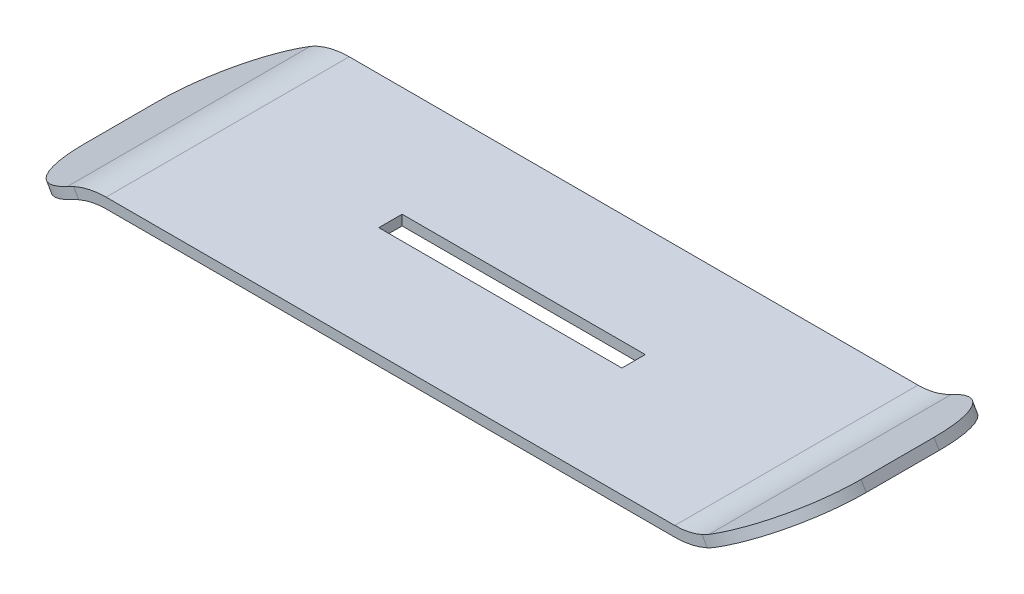
ISO-10303-21;
HEADER;
FILE_DESCRIPTION(('STEP AP214'),'2;1');
FILE_NAME('part.step','',(''),(''),'','','');
FILE_SCHEMA(('AUTOMOTIVE_DESIGN { 1 0 10303 214 1 1 1 1 }'));
ENDSEC;
DATA;
#1=APPLICATION_CONTEXT('core data for automotive mechanical design processes');
#2=APPLICATION_PROTOCOL_DEFINITION('international standard','automotive_design',2000,#1);
#3=PRODUCT_CONTEXT('',#1,'mechanical');
#4=PRODUCT('Part','Part','',(#3));
#5=PRODUCT_RELATED_PRODUCT_CATEGORY('part','',(#4));
#6=PRODUCT_DEFINITION_FORMATION('','',#4);
#7=PRODUCT_DEFINITION_CONTEXT('part definition',#1,'design');
#8=PRODUCT_DEFINITION('design','',#6,#7);
#9=PRODUCT_DEFINITION_SHAPE('','',#8);
#10=(LENGTH_UNIT() NAMED_UNIT(*) SI_UNIT(.MILLI.,.METRE.));
#11=(NAMED_UNIT(*) PLANE_ANGLE_UNIT() SI_UNIT($,.RADIAN.));
#12=(NAMED_UNIT(*) SI_UNIT($,.STERADIAN.) SOLID_ANGLE_UNIT());
#13=UNCERTAINTY_MEASURE_WITH_UNIT(LENGTH_MEASURE(1.E-05),#10,'distance_accuracy_value','');
#14=(GEOMETRIC_REPRESENTATION_CONTEXT(3) GLOBAL_UNCERTAINTY_ASSIGNED_CONTEXT((#13)) GLOBAL_UNIT_ASSIGNED_CONTEXT((#10,
#11,#12)) REPRESENTATION_CONTEXT('',''));
#15=CARTESIAN_POINT('',(0.,0.,0.));
#16=DIRECTION('',(0.,0.,1.));
#17=DIRECTION('',(1.,0.,0.));
#18=AXIS2_PLACEMENT_3D('',#15,#16,#17);
#19=CARTESIAN_POINT('',(-33.7849271536748,-0.558948472783927,12.7));
#20=DIRECTION('',(0.499999999999995,-0.866025403784442,0.));
#21=DIRECTION('',(0.866025403784442,0.499999999999995,0.));
#22=AXIS2_PLACEMENT_3D('',#19,#20,#21);
#23=PLANE('',#22);
#24=DIRECTION('',(0.,0.,-1.));
#25=VECTOR('',#24,1.);
#26=CARTESIAN_POINT('',(-33.7849271536748,-0.558948472783927,12.7));
#27=LINE('',#26,#25);
#28=CARTESIAN_POINT('',(-33.7849271536748,-0.558948472783927,12.6664364545609));
#29=VERTEX_POINT('',#28);
#30=CARTESIAN_POINT('',(-33.7849271536748,-0.558948472783927,-12.6664364545609));
#31=VERTEX_POINT('',#30);
#32=EDGE_CURVE('E242',#29,#31,#27,.T.);
#33=ORIENTED_EDGE('',*,*,#32,.T.);
#34=CARTESIAN_POINT('',(-33.1165522628063,-0.17306204962142,-3.81));
#35=DIRECTION('',(0.499999999999995,-0.866025403784442,0.));
#36=DIRECTION('',(0.866025403784442,0.499999999999995,0.));
#37=AXIS2_PLACEMENT_3D('',#34,#35,#36);
#38=CIRCLE('',#37,8.89);
#39=CARTESIAN_POINT('',(-40.81551810245,-4.61806204962138,-3.81));
#40=VERTEX_POINT('',#39);
#41=EDGE_CURVE('E391',#31,#40,#38,.F.);
#42=ORIENTED_EDGE('',*,*,#41,.T.);
#43=DIRECTION('',(0.,0.,-1.));
#44=VECTOR('',#43,1.);
#45=CARTESIAN_POINT('',(-40.81551810245,-4.61806204962138,12.7));
#46=LINE('',#45,#44);
#47=CARTESIAN_POINT('',(-40.81551810245,-4.61806204962138,3.81));
#48=VERTEX_POINT('',#47);
#49=EDGE_CURVE('E287',#48,#40,#46,.T.);
#50=ORIENTED_EDGE('',*,*,#49,.F.);
#51=CARTESIAN_POINT('',(-33.1165522628063,-0.17306204962142,3.81));
#52=DIRECTION('',(0.499999999999995,-0.866025403784442,0.));
#53=DIRECTION('',(0.866025403784442,0.499999999999995,0.));
#54=AXIS2_PLACEMENT_3D('',#51,#52,#53);
#55=CIRCLE('',#54,8.89);
#56=EDGE_CURVE('E393',#48,#29,#55,.F.);
#57=ORIENTED_EDGE('',*,*,#56,.T.);
#58=EDGE_LOOP('',(#33,#42,#50,#57));
#59=FACE_BOUND('',#58,.T.);
#60=ADVANCED_FACE('F49',(#59),#23,.F.);
#61=CARTESIAN_POINT('',(-40.28211810245,-5.54193795037863,12.7));
#62=DIRECTION('',(-0.866025403784444,-0.499999999999991,0.));
#63=DIRECTION('',(0.499999999999991,-0.866025403784444,0.));
#64=AXIS2_PLACEMENT_3D('',#61,#62,#63);
#65=PLANE('',#64);
#66=ORIENTED_EDGE('',*,*,#49,.T.);
#67=DIRECTION('',(-0.499999999999991,0.866025403784444,0.));
#68=VECTOR('',#67,1.);
#69=CARTESIAN_POINT('',(-40.28211810245,-5.54193795037863,-3.81));
#70=LINE('',#69,#68);
#71=CARTESIAN_POINT('',(-40.28211810245,-5.54193795037863,-3.81));
#72=VERTEX_POINT('',#71);
#73=EDGE_CURVE('E386',#40,#72,#70,.F.);
#74=ORIENTED_EDGE('',*,*,#73,.T.);
#75=DIRECTION('',(0.,0.,-1.));
#76=VECTOR('',#75,1.);
#77=CARTESIAN_POINT('',(-40.28211810245,-5.54193795037863,12.7));
#78=LINE('',#77,#76);
#79=CARTESIAN_POINT('',(-40.28211810245,-5.54193795037863,3.81));
#80=VERTEX_POINT('',#79);
#81=EDGE_CURVE('E284',#80,#72,#78,.T.);
#82=ORIENTED_EDGE('',*,*,#81,.F.);
#83=DIRECTION('',(-0.499999999999991,0.866025403784444,0.));
#84=VECTOR('',#83,1.);
#85=CARTESIAN_POINT('',(-40.28211810245,-5.54193795037863,3.81));
#86=LINE('',#85,#84);
#87=EDGE_CURVE('E388',#80,#48,#86,.T.);
#88=ORIENTED_EDGE('',*,*,#87,.T.);
#89=EDGE_LOOP('',(#66,#74,#82,#88));
#90=FACE_BOUND('',#89,.T.);
#91=ADVANCED_FACE('F362',(#90),#65,.T.);
#92=CARTESIAN_POINT('',(-33.2515271536748,-1.48282437354116,12.7));
#93=DIRECTION('',(0.499999999999995,-0.866025403784442,0.));
#94=DIRECTION('',(0.866025403784442,0.499999999999995,0.));
#95=AXIS2_PLACEMENT_3D('',#92,#93,#94);
#96=PLANE('',#95);
#97=ORIENTED_EDGE('',*,*,#81,.T.);
#98=CARTESIAN_POINT('',(-32.5831522628063,-1.09693795037866,-3.81));
#99=DIRECTION('',(0.499999999999995,-0.866025403784442,0.));
#100=DIRECTION('',(0.866025403784442,0.499999999999995,0.));
#101=AXIS2_PLACEMENT_3D('',#98,#99,#100);
#102=CIRCLE('',#101,8.89);
#103=CARTESIAN_POINT('',(-33.2515271536748,-1.48282437354116,-12.6664364545609));
#104=VERTEX_POINT('',#103);
#105=EDGE_CURVE('E382',#72,#104,#102,.T.);
#106=ORIENTED_EDGE('',*,*,#105,.T.);
#107=DIRECTION('',(0.,0.,-1.));
#108=VECTOR('',#107,1.);
#109=CARTESIAN_POINT('',(-33.2515271536748,-1.48282437354116,12.7));
#110=LINE('',#109,#108);
#111=CARTESIAN_POINT('',(-33.2515271536748,-1.48282437354116,12.6664364545609));
#112=VERTEX_POINT('',#111);
#113=EDGE_CURVE('E281',#112,#104,#110,.T.);
#114=ORIENTED_EDGE('',*,*,#113,.F.);
#115=CARTESIAN_POINT('',(-32.5831522628063,-1.09693795037866,3.81));
#116=DIRECTION('',(0.499999999999995,-0.866025403784442,0.));
#117=DIRECTION('',(0.866025403784442,0.499999999999995,0.));
#118=AXIS2_PLACEMENT_3D('',#115,#116,#117);
#119=CIRCLE('',#118,8.89);
#120=EDGE_CURVE('E384',#112,#80,#119,.T.);
#121=ORIENTED_EDGE('',*,*,#120,.T.);
#122=EDGE_LOOP('',(#97,#106,#114,#121));
#123=FACE_BOUND('',#122,.T.);
#124=ADVANCED_FACE('F367',(#123),#96,.T.);
#125=CARTESIAN_POINT('',(-29.7082271536748,-7.61999999999999,12.7));
#126=DIRECTION('',(0.,0.,-1.));
#127=DIRECTION('',(-1.,0.,0.));
#128=AXIS2_PLACEMENT_3D('',#125,#126,#127);
#129=CYLINDRICAL_SURFACE('',#128,7.0866);
#130=ORIENTED_EDGE('',*,*,#113,.T.);
#131=CARTESIAN_POINT('',(-33.2515271536748,-1.48282437354116,-12.6664364545609));
#132=CARTESIAN_POINT('',(-33.1400139126159,-1.41843288654396,-12.6776383215602));
#133=CARTESIAN_POINT('',(-33.0268031062153,-1.35712190436121,-12.6860362171797));
#134=CARTESIAN_POINT('',(-32.79698636273,-1.24066094962438,-12.6972240656595));
#135=CARTESIAN_POINT('',(-32.6803804256454,-1.18551097707032,-12.7000140185196));
#136=CARTESIAN_POINT('',(-32.562076923219,-1.13344150933074,-12.7));
#137=B_SPLINE_CURVE_WITH_KNOTS('',3,(#131,#132,#133,#134,#135,#136),.UNSPECIFIED.,.F.,.F.,(4,2,
4),(0.,0.387061016968164,0.774122033937768),.UNSPECIFIED.);
#138=CARTESIAN_POINT('',(-32.562076923219,-1.13344150933076,-12.7));
#139=VERTEX_POINT('',#138);
#140=EDGE_CURVE('E13',#104,#139,#137,.T.);
#141=ORIENTED_EDGE('',*,*,#140,.T.);
#142=CARTESIAN_POINT('',(-29.7082271536748,-7.61999999999999,-12.7));
#143=DIRECTION('',(0.,0.,1.));
#144=DIRECTION('',(1.,0.,0.));
#145=AXIS2_PLACEMENT_3D('',#142,#143,#144);
#146=CIRCLE('',#145,7.0866);
#147=CARTESIAN_POINT('',(-29.7082271536749,-0.533399999999989,-12.7));
#148=VERTEX_POINT('',#147);
#149=EDGE_CURVE('E225',#148,#139,#146,.T.);
#150=ORIENTED_EDGE('',*,*,#149,.F.);
#151=DIRECTION('',(0.,0.,-1.));
#152=VECTOR('',#151,1.);
#153=CARTESIAN_POINT('',(-29.7082271536749,-0.533399999999989,12.7));
#154=LINE('',#153,#152);
#155=CARTESIAN_POINT('',(-29.7082271536749,-0.533399999999989,12.7));
#156=VERTEX_POINT('',#155);
#157=EDGE_CURVE('E279',#156,#148,#154,.T.);
#158=ORIENTED_EDGE('',*,*,#157,.F.);
#159=CARTESIAN_POINT('',(-29.7082271536748,-7.61999999999999,12.7));
#160=DIRECTION('',(0.,0.,1.));
#161=DIRECTION('',(1.,0.,0.));
#162=AXIS2_PLACEMENT_3D('',#159,#160,#161);
#163=CIRCLE('',#162,7.0866);
#164=CARTESIAN_POINT('',(-32.562076923219,-1.13344150933076,12.7));
#165=VERTEX_POINT('',#164);
#166=EDGE_CURVE('E226',#156,#165,#163,.T.);
#167=ORIENTED_EDGE('',*,*,#166,.T.);
#168=CARTESIAN_POINT('',(-32.562076923219,-1.13344150933076,12.7));
#169=CARTESIAN_POINT('',(-32.6803804256454,-1.18551097707033,12.7000140185196));
#170=CARTESIAN_POINT('',(-32.79698636273,-1.24066094962438,12.6972240656595));
#171=CARTESIAN_POINT('',(-33.0268031062153,-1.35712190436121,12.6860362171797));
#172=CARTESIAN_POINT('',(-33.1400139126159,-1.41843288654396,12.6776383215602));
#173=CARTESIAN_POINT('',(-33.2515271536748,-1.48282437354116,12.6664364545609));
#174=B_SPLINE_CURVE_WITH_KNOTS('',3,(#168,#169,#170,#171,#172,#173),.UNSPECIFIED.,.F.,.F.,(4,2,
4),(0.,0.387061016969606,0.774122033937767),.UNSPECIFIED.);
#175=EDGE_CURVE('E62',#165,#112,#174,.T.);
#176=ORIENTED_EDGE('',*,*,#175,.T.);
#177=EDGE_LOOP('',(#130,#141,#150,#158,#167,#176));
#178=FACE_BOUND('',#177,.T.);
#179=ADVANCED_FACE('F372',(#178),#129,.F.);
#180=CARTESIAN_POINT('',(-29.7082271536749,-0.533399999999989,12.7));
#181=DIRECTION('',(0.,-1.,0.));
#182=DIRECTION('',(1.,0.,0.));
#183=AXIS2_PLACEMENT_3D('',#180,#181,#182);
#184=PLANE('',#183);
#185=DIRECTION('',(0.,0.,1.));
#186=VECTOR('',#185,1.);
#187=CARTESIAN_POINT('',(12.7,-0.533399999999989,12.7));
#188=LINE('',#187,#186);
#189=CARTESIAN_POINT('',(12.7,-0.533400000000003,-1.2192));
#190=VERTEX_POINT('',#189);
#191=CARTESIAN_POINT('',(12.7,-0.533400000000003,1.2192));
#192=VERTEX_POINT('',#191);
#193=EDGE_CURVE('E223',#190,#192,#188,.T.);
#194=ORIENTED_EDGE('',*,*,#193,.F.);
#195=DIRECTION('',(1.,0.,0.));
#196=VECTOR('',#195,1.);
#197=CARTESIAN_POINT('',(-29.7082271536749,-0.533399999999989,-1.2192));
#198=LINE('',#197,#196);
#199=CARTESIAN_POINT('',(-12.7,-0.533399999999989,-1.2192));
#200=VERTEX_POINT('',#199);
#201=EDGE_CURVE('E216',#200,#190,#198,.T.);
#202=ORIENTED_EDGE('',*,*,#201,.F.);
#203=DIRECTION('',(0.,0.,-1.));
#204=VECTOR('',#203,1.);
#205=CARTESIAN_POINT('',(-12.7,-0.533399999999989,12.7));
#206=LINE('',#205,#204);
#207=CARTESIAN_POINT('',(-12.7,-0.533399999999989,1.2192));
#208=VERTEX_POINT('',#207);
#209=EDGE_CURVE('E196',#208,#200,#206,.T.);
#210=ORIENTED_EDGE('',*,*,#209,.F.);
#211=DIRECTION('',(-1.,0.,0.));
#212=VECTOR('',#211,1.);
#213=CARTESIAN_POINT('',(-29.7082271536749,-0.533399999999989,1.2192));
#214=LINE('',#213,#212);
#215=EDGE_CURVE('E221',#192,#208,#214,.T.);
#216=ORIENTED_EDGE('',*,*,#215,.F.);
#217=EDGE_LOOP('',(#194,#202,#210,#216));
#218=FACE_BOUND('',#217,.T.);
#219=DIRECTION('',(-1.,0.,0.));
#220=VECTOR('',#219,1.);
#221=CARTESIAN_POINT('',(-29.7082271536749,-0.533399999999989,-12.7));
#222=LINE('',#221,#220);
#223=CARTESIAN_POINT('',(29.7082271536749,-0.533399999999989,-12.7));
#224=VERTEX_POINT('',#223);
#225=EDGE_CURVE('E245',#224,#148,#222,.T.);
#226=ORIENTED_EDGE('',*,*,#225,.F.);
#227=DIRECTION('',(0.,0.,-1.));
#228=VECTOR('',#227,1.);
#229=CARTESIAN_POINT('',(29.7082271536749,-0.533399999999989,12.7));
#230=LINE('',#229,#228);
#231=CARTESIAN_POINT('',(29.7082271536749,-0.533399999999989,12.7));
#232=VERTEX_POINT('',#231);
#233=EDGE_CURVE('E276',#232,#224,#230,.T.);
#234=ORIENTED_EDGE('',*,*,#233,.F.);
#235=DIRECTION('',(-1.,0.,0.));
#236=VECTOR('',#235,1.);
#237=CARTESIAN_POINT('',(-29.7082271536749,-0.533399999999989,12.7));
#238=LINE('',#237,#236);
#239=EDGE_CURVE('E229',#232,#156,#238,.T.);
#240=ORIENTED_EDGE('',*,*,#239,.T.);
#241=ORIENTED_EDGE('',*,*,#157,.T.);
#242=EDGE_LOOP('',(#226,#234,#240,#241));
#243=FACE_BOUND('',#242,.T.);
#244=ADVANCED_FACE('F359',(#218,#243),#184,.T.);
#245=CARTESIAN_POINT('',(29.7082271536748,7.62,12.7));
#246=DIRECTION('',(0.,0.,-1.));
#247=DIRECTION('',(-1.,0.,0.));
#248=AXIS2_PLACEMENT_3D('',#245,#246,#247);
#249=CYLINDRICAL_SURFACE('',#248,8.15339999999999);
#250=CARTESIAN_POINT('',(29.7082271536748,7.62,-12.7));
#251=DIRECTION('',(0.,0.,1.));
#252=DIRECTION('',(1.,0.,0.));
#253=AXIS2_PLACEMENT_3D('',#250,#251,#252);
#254=CIRCLE('',#253,8.15339999999999);
#255=CARTESIAN_POINT('',(33.0982478273636,0.204766261811901,-12.7));
#256=VERTEX_POINT('',#255);
#257=EDGE_CURVE('E248',#256,#224,#254,.F.);
#258=ORIENTED_EDGE('',*,*,#257,.F.);
#259=CARTESIAN_POINT('',(33.0982478273636,0.204766261811901,-12.7));
#260=CARTESIAN_POINT('',(33.2157092464788,0.258482529247828,-12.70000993008));
#261=CARTESIAN_POINT('',(33.331663233229,0.314855847213476,-12.697217933));
#262=CARTESIAN_POINT('',(33.5605563419994,0.432916584204165,-12.6860300845203));
#263=CARTESIAN_POINT('',(33.6734954640196,0.494604003229202,-12.6776342331205));
#264=CARTESIAN_POINT('',(33.7849271536749,0.558948472783954,-12.6664364545609));
#265=B_SPLINE_CURVE_WITH_KNOTS('',3,(#259,#260,#261,#262,#263,#264),.UNSPECIFIED.,.F.,.F.,(4,2,
4),(0.,0.386884555681372,0.773769111362435),.UNSPECIFIED.);
#266=CARTESIAN_POINT('',(33.7849271536749,0.558948472783954,-12.6664364545609));
#267=VERTEX_POINT('',#266);
#268=EDGE_CURVE('E303',#256,#267,#265,.T.);
#269=ORIENTED_EDGE('',*,*,#268,.T.);
#270=DIRECTION('',(0.,0.,-1.));
#271=VECTOR('',#270,1.);
#272=CARTESIAN_POINT('',(33.7849271536749,0.558948472783954,12.7));
#273=LINE('',#272,#271);
#274=CARTESIAN_POINT('',(33.7849271536749,0.558948472783954,12.6664364545609));
#275=VERTEX_POINT('',#274);
#276=EDGE_CURVE('E273',#275,#267,#273,.T.);
#277=ORIENTED_EDGE('',*,*,#276,.F.);
#278=CARTESIAN_POINT('',(33.7849271536749,0.558948472783954,12.6664364545609));
#279=CARTESIAN_POINT('',(33.6734954640196,0.494604003229202,12.6776342331205));
#280=CARTESIAN_POINT('',(33.5605563419994,0.432916584204165,12.6860300845203));
#281=CARTESIAN_POINT('',(33.331663233229,0.314855847213477,12.697217933));
#282=CARTESIAN_POINT('',(33.2157092464788,0.258482529247828,12.70000993008));
#283=CARTESIAN_POINT('',(33.0982478273636,0.204766261811901,12.7));
#284=B_SPLINE_CURVE_WITH_KNOTS('',3,(#278,#279,#280,#281,#282,#283),.UNSPECIFIED.,.F.,.F.,(4,2,
4),(0.,0.386884555681063,0.773769111362435),.UNSPECIFIED.);
#285=CARTESIAN_POINT('',(33.0982478273636,0.204766261811901,12.7));
#286=VERTEX_POINT('',#285);
#287=EDGE_CURVE('E296',#275,#286,#284,.T.);
#288=ORIENTED_EDGE('',*,*,#287,.T.);
#289=CARTESIAN_POINT('',(29.7082271536748,7.62,12.7));
#290=DIRECTION('',(0.,0.,1.));
#291=DIRECTION('',(1.,0.,0.));
#292=AXIS2_PLACEMENT_3D('',#289,#290,#291);
#293=CIRCLE('',#292,8.15339999999999);
#294=EDGE_CURVE('E233',#286,#232,#293,.F.);
#295=ORIENTED_EDGE('',*,*,#294,.T.);
#296=ORIENTED_EDGE('',*,*,#233,.T.);
#297=EDGE_LOOP('',(#258,#269,#277,#288,#295,#296));
#298=FACE_BOUND('',#297,.T.);
#299=ADVANCED_FACE('F309',(#298),#249,.T.);
#300=CARTESIAN_POINT('',(33.7849271536749,0.558948472783954,12.7));
#301=DIRECTION('',(0.500000000000002,-0.866025403784438,0.));
#302=DIRECTION('',(0.866025403784438,0.500000000000002,0.));
#303=AXIS2_PLACEMENT_3D('',#300,#301,#302);
#304=PLANE('',#303);
#305=ORIENTED_EDGE('',*,*,#276,.T.);
#306=CARTESIAN_POINT('',(33.1165522628062,0.173062049621364,-3.81));
#307=DIRECTION('',(0.500000000000002,-0.866025403784438,0.));
#308=DIRECTION('',(0.866025403784438,0.500000000000002,0.));
#309=AXIS2_PLACEMENT_3D('',#306,#307,#308);
#310=CIRCLE('',#309,8.89);
#311=CARTESIAN_POINT('',(40.8155181024499,4.61806204962138,-3.81));
#312=VERTEX_POINT('',#311);
#313=EDGE_CURVE('E465',#267,#312,#310,.T.);
#314=ORIENTED_EDGE('',*,*,#313,.T.);
#315=DIRECTION('',(0.,0.,-1.));
#316=VECTOR('',#315,1.);
#317=CARTESIAN_POINT('',(40.8155181024499,4.61806204962138,12.7));
#318=LINE('',#317,#316);
#319=CARTESIAN_POINT('',(40.8155181024499,4.61806204962138,3.81));
#320=VERTEX_POINT('',#319);
#321=EDGE_CURVE('E270',#320,#312,#318,.T.);
#322=ORIENTED_EDGE('',*,*,#321,.F.);
#323=CARTESIAN_POINT('',(33.1165522628062,0.173062049621364,3.81));
#324=DIRECTION('',(0.500000000000002,-0.866025403784438,0.));
#325=DIRECTION('',(0.866025403784438,0.500000000000002,0.));
#326=AXIS2_PLACEMENT_3D('',#323,#324,#325);
#327=CIRCLE('',#326,8.89);
#328=EDGE_CURVE('E466',#320,#275,#327,.T.);
#329=ORIENTED_EDGE('',*,*,#328,.T.);
#330=EDGE_LOOP('',(#305,#314,#322,#329));
#331=FACE_BOUND('',#330,.T.);
#332=ADVANCED_FACE('F352',(#331),#304,.T.);
#333=CARTESIAN_POINT('',(40.2821181024499,5.54193795037862,12.7));
#334=DIRECTION('',(0.866025403784437,0.500000000000002,0.));
#335=DIRECTION('',(-0.500000000000002,0.866025403784437,0.));
#336=AXIS2_PLACEMENT_3D('',#333,#334,#335);
#337=PLANE('',#336);
#338=ORIENTED_EDGE('',*,*,#321,.T.);
#339=DIRECTION('',(0.500000000000002,-0.866025403784437,0.));
#340=VECTOR('',#339,1.);
#341=CARTESIAN_POINT('',(40.2821181024499,5.54193795037862,-3.81));
#342=LINE('',#341,#340);
#343=CARTESIAN_POINT('',(40.2821181024499,5.54193795037862,-3.81));
#344=VERTEX_POINT('',#343);
#345=EDGE_CURVE('E473',#312,#344,#342,.F.);
#346=ORIENTED_EDGE('',*,*,#345,.T.);
#347=DIRECTION('',(0.,0.,-1.));
#348=VECTOR('',#347,1.);
#349=CARTESIAN_POINT('',(40.2821181024499,5.54193795037862,12.7));
#350=LINE('',#349,#348);
#351=CARTESIAN_POINT('',(40.2821181024499,5.54193795037862,3.81));
#352=VERTEX_POINT('',#351);
#353=EDGE_CURVE('E267',#352,#344,#350,.T.);
#354=ORIENTED_EDGE('',*,*,#353,.F.);
#355=DIRECTION('',(0.500000000000002,-0.866025403784437,0.));
#356=VECTOR('',#355,1.);
#357=CARTESIAN_POINT('',(40.2821181024499,5.54193795037862,3.81));
#358=LINE('',#357,#356);
#359=EDGE_CURVE('E468',#352,#320,#358,.T.);
#360=ORIENTED_EDGE('',*,*,#359,.T.);
#361=EDGE_LOOP('',(#338,#346,#354,#360));
#362=FACE_BOUND('',#361,.T.);
#363=ADVANCED_FACE('F349',(#362),#337,.T.);
#364=CARTESIAN_POINT('',(33.2515271536749,1.48282437354119,12.7));
#365=DIRECTION('',(0.500000000000002,-0.866025403784438,0.));
#366=DIRECTION('',(0.866025403784438,0.500000000000002,0.));
#367=AXIS2_PLACEMENT_3D('',#364,#365,#366);
#368=PLANE('',#367);
#369=ORIENTED_EDGE('',*,*,#353,.T.);
#370=CARTESIAN_POINT('',(32.5831522628062,1.0969379503786,-3.81));
#371=DIRECTION('',(0.500000000000002,-0.866025403784438,0.));
#372=DIRECTION('',(0.866025403784438,0.500000000000002,0.));
#373=AXIS2_PLACEMENT_3D('',#370,#371,#372);
#374=CIRCLE('',#373,8.89);
#375=CARTESIAN_POINT('',(33.2515271536749,1.48282437354119,-12.6664364545609));
#376=VERTEX_POINT('',#375);
#377=EDGE_CURVE('E332',#344,#376,#374,.F.);
#378=ORIENTED_EDGE('',*,*,#377,.T.);
#379=DIRECTION('',(0.,0.,-1.));
#380=VECTOR('',#379,1.);
#381=CARTESIAN_POINT('',(33.2515271536749,1.48282437354119,12.7));
#382=LINE('',#381,#380);
#383=CARTESIAN_POINT('',(33.2515271536749,1.48282437354119,12.6664364545609));
#384=VERTEX_POINT('',#383);
#385=EDGE_CURVE('E264',#384,#376,#382,.T.);
#386=ORIENTED_EDGE('',*,*,#385,.F.);
#387=CARTESIAN_POINT('',(32.5831522628062,1.0969379503786,3.81));
#388=DIRECTION('',(0.500000000000002,-0.866025403784438,0.));
#389=DIRECTION('',(0.866025403784438,0.500000000000002,0.));
#390=AXIS2_PLACEMENT_3D('',#387,#388,#389);
#391=CIRCLE('',#390,8.89);
#392=EDGE_CURVE('E474',#384,#352,#391,.F.);
#393=ORIENTED_EDGE('',*,*,#392,.T.);
#394=EDGE_LOOP('',(#369,#378,#386,#393));
#395=FACE_BOUND('',#394,.T.);
#396=ADVANCED_FACE('F343',(#395),#368,.F.);
#397=CARTESIAN_POINT('',(29.7082271536748,7.62,12.7));
#398=DIRECTION('',(0.,0.,-1.));
#399=DIRECTION('',(-1.,0.,0.));
#400=AXIS2_PLACEMENT_3D('',#397,#398,#399);
#401=CYLINDRICAL_SURFACE('',#400,7.0866);
#402=ORIENTED_EDGE('',*,*,#385,.T.);
#403=CARTESIAN_POINT('',(33.2515271536749,1.48282437354119,-12.6664364545609));
#404=CARTESIAN_POINT('',(33.1400139126159,1.41843288654398,-12.6776383215602));
#405=CARTESIAN_POINT('',(33.0268031062153,1.35712190436121,-12.6860362171797));
#406=CARTESIAN_POINT('',(32.79698636273,1.24066094962436,-12.6972240656595));
#407=CARTESIAN_POINT('',(32.6803804256453,1.1855109770703,-12.7000140185196));
#408=CARTESIAN_POINT('',(32.5620769232189,1.13344150933072,-12.7));
#409=B_SPLINE_CURVE_WITH_KNOTS('',3,(#403,#404,#405,#406,#407,#408),.UNSPECIFIED.,.F.,.F.,(4,2,
4),(0.,0.38706101696824,0.774122033937911),.UNSPECIFIED.);
#410=CARTESIAN_POINT('',(32.5620769232189,1.13344150933073,-12.7));
#411=VERTEX_POINT('',#410);
#412=EDGE_CURVE('E331',#376,#411,#409,.T.);
#413=ORIENTED_EDGE('',*,*,#412,.T.);
#414=CARTESIAN_POINT('',(29.7082271536748,7.62,-12.7));
#415=DIRECTION('',(0.,0.,1.));
#416=DIRECTION('',(1.,0.,0.));
#417=AXIS2_PLACEMENT_3D('',#414,#415,#416);
#418=CIRCLE('',#417,7.0866);
#419=CARTESIAN_POINT('',(29.7082271536749,0.533400000000003,-12.7));
#420=VERTEX_POINT('',#419);
#421=EDGE_CURVE('E250',#411,#420,#418,.F.);
#422=ORIENTED_EDGE('',*,*,#421,.T.);
#423=DIRECTION('',(0.,0.,-1.));
#424=VECTOR('',#423,1.);
#425=CARTESIAN_POINT('',(29.7082271536749,0.533400000000003,12.7));
#426=LINE('',#425,#424);
#427=CARTESIAN_POINT('',(29.7082271536749,0.533400000000003,12.7));
#428=VERTEX_POINT('',#427);
#429=EDGE_CURVE('E261',#428,#420,#426,.T.);
#430=ORIENTED_EDGE('',*,*,#429,.F.);
#431=CARTESIAN_POINT('',(29.7082271536748,7.62,12.7));
#432=DIRECTION('',(0.,0.,1.));
#433=DIRECTION('',(1.,0.,0.));
#434=AXIS2_PLACEMENT_3D('',#431,#432,#433);
#435=CIRCLE('',#434,7.0866);
#436=CARTESIAN_POINT('',(32.5620769232189,1.13344150933073,12.7));
#437=VERTEX_POINT('',#436);
#438=EDGE_CURVE('E235',#437,#428,#435,.F.);
#439=ORIENTED_EDGE('',*,*,#438,.F.);
#440=CARTESIAN_POINT('',(32.5620769232189,1.13344150933072,12.7));
#441=CARTESIAN_POINT('',(32.6803804256453,1.1855109770703,12.7000140185196));
#442=CARTESIAN_POINT('',(32.79698636273,1.24066094962436,12.6972240656595));
#443=CARTESIAN_POINT('',(33.0268031062153,1.35712190436121,12.6860362171797));
#444=CARTESIAN_POINT('',(33.140013912616,1.41843288654398,12.6776383215602));
#445=CARTESIAN_POINT('',(33.2515271536749,1.48282437354119,12.6664364545609));
#446=B_SPLINE_CURVE_WITH_KNOTS('',3,(#440,#441,#442,#443,#444,#445),.UNSPECIFIED.,.F.,.F.,(4,2,
4),(0.,0.387061016969684,0.774122033937929),.UNSPECIFIED.);
#447=EDGE_CURVE('E324',#437,#384,#446,.T.);
#448=ORIENTED_EDGE('',*,*,#447,.T.);
#449=EDGE_LOOP('',(#402,#413,#422,#430,#439,#448));
#450=FACE_BOUND('',#449,.T.);
#451=ADVANCED_FACE('F338',(#450),#401,.F.);
#452=CARTESIAN_POINT('',(-29.7082271536749,0.533400000000003,12.7));
#453=DIRECTION('',(0.,-1.,0.));
#454=DIRECTION('',(1.,0.,0.));
#455=AXIS2_PLACEMENT_3D('',#452,#453,#454);
#456=PLANE('',#455);
#457=DIRECTION('',(-1.,0.,0.));
#458=VECTOR('',#457,1.);
#459=CARTESIAN_POINT('',(-12.7,0.533400000000003,-1.2192));
#460=LINE('',#459,#458);
#461=CARTESIAN_POINT('',(12.7,0.533400000000003,-1.2192));
#462=VERTEX_POINT('',#461);
#463=CARTESIAN_POINT('',(-12.7,0.533400000000003,-1.2192));
#464=VERTEX_POINT('',#463);
#465=EDGE_CURVE('E202',#462,#464,#460,.T.);
#466=ORIENTED_EDGE('',*,*,#465,.F.);
#467=DIRECTION('',(0.,0.,-1.));
#468=VECTOR('',#467,1.);
#469=CARTESIAN_POINT('',(12.7,0.533400000000003,-1.2192));
#470=LINE('',#469,#468);
#471=CARTESIAN_POINT('',(12.7,0.533400000000003,1.2192));
#472=VERTEX_POINT('',#471);
#473=EDGE_CURVE('E77',#472,#462,#470,.T.);
#474=ORIENTED_EDGE('',*,*,#473,.F.);
#475=DIRECTION('',(1.,0.,0.));
#476=VECTOR('',#475,1.);
#477=CARTESIAN_POINT('',(-12.7,0.533400000000003,1.2192));
#478=LINE('',#477,#476);
#479=CARTESIAN_POINT('',(-12.7,0.533400000000003,1.2192));
#480=VERTEX_POINT('',#479);
#481=EDGE_CURVE('E209',#480,#472,#478,.T.);
#482=ORIENTED_EDGE('',*,*,#481,.F.);
#483=DIRECTION('',(0.,0.,1.));
#484=VECTOR('',#483,1.);
#485=CARTESIAN_POINT('',(-12.7,0.533400000000003,-1.2192));
#486=LINE('',#485,#484);
#487=EDGE_CURVE('E193',#464,#480,#486,.T.);
#488=ORIENTED_EDGE('',*,*,#487,.F.);
#489=EDGE_LOOP('',(#466,#474,#482,#488));
#490=FACE_BOUND('',#489,.T.);
#491=DIRECTION('',(-1.,0.,0.));
#492=VECTOR('',#491,1.);
#493=CARTESIAN_POINT('',(-29.7082271536749,0.533400000000003,-12.7));
#494=LINE('',#493,#492);
#495=CARTESIAN_POINT('',(-29.7082271536749,0.533400000000003,-12.7));
#496=VERTEX_POINT('',#495);
#497=EDGE_CURVE('E252',#420,#496,#494,.T.);
#498=ORIENTED_EDGE('',*,*,#497,.T.);
#499=DIRECTION('',(0.,0.,-1.));
#500=VECTOR('',#499,1.);
#501=CARTESIAN_POINT('',(-29.7082271536749,0.533400000000003,12.7));
#502=LINE('',#501,#500);
#503=CARTESIAN_POINT('',(-29.7082271536749,0.533400000000003,12.7));
#504=VERTEX_POINT('',#503);
#505=EDGE_CURVE('E258',#504,#496,#502,.T.);
#506=ORIENTED_EDGE('',*,*,#505,.F.);
#507=DIRECTION('',(-1.,0.,0.));
#508=VECTOR('',#507,1.);
#509=CARTESIAN_POINT('',(-29.7082271536749,0.533400000000003,12.7));
#510=LINE('',#509,#508);
#511=EDGE_CURVE('E237',#428,#504,#510,.T.);
#512=ORIENTED_EDGE('',*,*,#511,.F.);
#513=ORIENTED_EDGE('',*,*,#429,.T.);
#514=EDGE_LOOP('',(#498,#506,#512,#513));
#515=FACE_BOUND('',#514,.T.);
#516=ADVANCED_FACE('F206',(#490,#515),#456,.F.);
#517=CARTESIAN_POINT('',(-29.7082271536748,-7.61999999999999,12.7));
#518=DIRECTION('',(0.,0.,-1.));
#519=DIRECTION('',(-1.,0.,0.));
#520=AXIS2_PLACEMENT_3D('',#517,#518,#519);
#521=CYLINDRICAL_SURFACE('',#520,8.1534);
#522=CARTESIAN_POINT('',(-29.7082271536748,-7.61999999999999,-12.7));
#523=DIRECTION('',(0.,0.,1.));
#524=DIRECTION('',(1.,0.,0.));
#525=AXIS2_PLACEMENT_3D('',#522,#523,#524);
#526=CIRCLE('',#525,8.1534);
#527=CARTESIAN_POINT('',(-33.0982478273637,-0.204766261811942,-12.7));
#528=VERTEX_POINT('',#527);
#529=EDGE_CURVE('E230',#496,#528,#526,.T.);
#530=ORIENTED_EDGE('',*,*,#529,.T.);
#531=CARTESIAN_POINT('',(-33.0982478273637,-0.204766261811942,-12.7));
#532=CARTESIAN_POINT('',(-33.2157092464788,-0.258482529247854,-12.70000993008));
#533=CARTESIAN_POINT('',(-33.331663233229,-0.314855847213488,-12.697217933));
#534=CARTESIAN_POINT('',(-33.5605563419994,-0.432916584204153,-12.6860300845203));
#535=CARTESIAN_POINT('',(-33.6734954640196,-0.494604003229181,-12.6776342331206));
#536=CARTESIAN_POINT('',(-33.7849271536748,-0.558948472783927,-12.6664364545609));
#537=B_SPLINE_CURVE_WITH_KNOTS('',3,(#531,#532,#533,#534,#535,#536),.UNSPECIFIED.,.F.,.F.,(4,2,
4),(0.,0.386884555681298,0.773769111362292),.UNSPECIFIED.);
#538=EDGE_CURVE('E395',#528,#31,#537,.T.);
#539=ORIENTED_EDGE('',*,*,#538,.T.);
#540=ORIENTED_EDGE('',*,*,#32,.F.);
#541=CARTESIAN_POINT('',(-33.7849271536748,-0.558948472783927,12.6664364545609));
#542=CARTESIAN_POINT('',(-33.6734954640196,-0.49460400322918,12.6776342331206));
#543=CARTESIAN_POINT('',(-33.5605563419994,-0.432916584204151,12.6860300845203));
#544=CARTESIAN_POINT('',(-33.331663233229,-0.314855847213481,12.697217933));
#545=CARTESIAN_POINT('',(-33.2157092464788,-0.258482529247844,12.70000993008));
#546=CARTESIAN_POINT('',(-33.0982478273637,-0.204766261811928,12.7));
#547=B_SPLINE_CURVE_WITH_KNOTS('',3,(#541,#542,#543,#544,#545,#546),.UNSPECIFIED.,.F.,.F.,(4,2,
4),(0.,0.386884555680997,0.773769111362293),.UNSPECIFIED.);
#548=CARTESIAN_POINT('',(-33.0982478273637,-0.204766261811942,12.7));
#549=VERTEX_POINT('',#548);
#550=EDGE_CURVE('E400',#29,#549,#547,.T.);
#551=ORIENTED_EDGE('',*,*,#550,.T.);
#552=CARTESIAN_POINT('',(-29.7082271536748,-7.61999999999999,12.7));
#553=DIRECTION('',(0.,0.,1.));
#554=DIRECTION('',(1.,0.,0.));
#555=AXIS2_PLACEMENT_3D('',#552,#553,#554);
#556=CIRCLE('',#555,8.1534);
#557=EDGE_CURVE('E239',#504,#549,#556,.T.);
#558=ORIENTED_EDGE('',*,*,#557,.F.);
#559=ORIENTED_EDGE('',*,*,#505,.T.);
#560=EDGE_LOOP('',(#530,#539,#540,#551,#558,#559));
#561=FACE_BOUND('',#560,.T.);
#562=ADVANCED_FACE('F405',(#561),#521,.T.);
#563=CARTESIAN_POINT('',(-29.7082271536748,-7.61999999999999,12.7));
#564=DIRECTION('',(0.,0.,1.));
#565=DIRECTION('',(1.,0.,0.));
#566=AXIS2_PLACEMENT_3D('',#563,#564,#565);
#567=PLANE('',#566);
#568=ORIENTED_EDGE('',*,*,#294,.F.);
#569=DIRECTION('',(0.500000000000002,-0.866025403784437,0.));
#570=VECTOR('',#569,1.);
#571=CARTESIAN_POINT('',(20.7848522628061,21.5321929933186,12.7));
#572=LINE('',#571,#570);
#573=EDGE_CURVE('E449',#286,#437,#572,.F.);
#574=ORIENTED_EDGE('',*,*,#573,.T.);
#575=ORIENTED_EDGE('',*,*,#438,.T.);
#576=ORIENTED_EDGE('',*,*,#511,.T.);
#577=ORIENTED_EDGE('',*,*,#557,.T.);
#578=DIRECTION('',(-0.499999999999991,0.866025403784444,0.));
#579=VECTOR('',#578,1.);
#580=CARTESIAN_POINT('',(-29.0398522628064,-7.23411357683751,12.7));
#581=LINE('',#580,#579);
#582=EDGE_CURVE('E454',#549,#165,#581,.F.);
#583=ORIENTED_EDGE('',*,*,#582,.T.);
#584=ORIENTED_EDGE('',*,*,#166,.F.);
#585=ORIENTED_EDGE('',*,*,#239,.F.);
#586=EDGE_LOOP('',(#568,#574,#575,#576,#577,#583,#584,#585));
#587=FACE_BOUND('',#586,.T.);
#588=ADVANCED_FACE('F409',(#587),#567,.T.);
#589=CARTESIAN_POINT('',(-29.7082271536748,-7.61999999999999,-12.7));
#590=DIRECTION('',(0.,0.,1.));
#591=DIRECTION('',(1.,0.,0.));
#592=AXIS2_PLACEMENT_3D('',#589,#590,#591);
#593=PLANE('',#592);
#594=ORIENTED_EDGE('',*,*,#421,.F.);
#595=DIRECTION('',(0.500000000000002,-0.866025403784437,0.));
#596=VECTOR('',#595,1.);
#597=CARTESIAN_POINT('',(33.1165522628063,0.173062049621364,-12.7));
#598=LINE('',#597,#596);
#599=EDGE_CURVE('E293',#411,#256,#598,.T.);
#600=ORIENTED_EDGE('',*,*,#599,.T.);
#601=ORIENTED_EDGE('',*,*,#257,.T.);
#602=ORIENTED_EDGE('',*,*,#225,.T.);
#603=ORIENTED_EDGE('',*,*,#149,.T.);
#604=DIRECTION('',(-0.499999999999991,0.866025403784444,0.));
#605=VECTOR('',#604,1.);
#606=CARTESIAN_POINT('',(-33.1165522628063,-0.173062049621447,-12.7));
#607=LINE('',#606,#605);
#608=EDGE_CURVE('E290',#139,#528,#607,.T.);
#609=ORIENTED_EDGE('',*,*,#608,.T.);
#610=ORIENTED_EDGE('',*,*,#529,.F.);
#611=ORIENTED_EDGE('',*,*,#497,.F.);
#612=EDGE_LOOP('',(#594,#600,#601,#602,#603,#609,#610,#611));
#613=FACE_BOUND('',#612,.T.);
#614=ADVANCED_FACE('F411',(#613),#593,.F.);
#615=CARTESIAN_POINT('',(20.7848522628061,21.5321929933186,-3.81));
#616=DIRECTION('',(-0.500000000000002,0.866025403784437,0.));
#617=DIRECTION('',(-0.866025403784437,-0.500000000000002,0.));
#618=AXIS2_PLACEMENT_3D('',#615,#616,#617);
#619=CYLINDRICAL_SURFACE('',#618,8.89);
#620=ORIENTED_EDGE('',*,*,#377,.F.);
#621=ORIENTED_EDGE('',*,*,#345,.F.);
#622=ORIENTED_EDGE('',*,*,#313,.F.);
#623=ORIENTED_EDGE('',*,*,#268,.F.);
#624=ORIENTED_EDGE('',*,*,#599,.F.);
#625=ORIENTED_EDGE('',*,*,#412,.F.);
#626=EDGE_LOOP('',(#620,#621,#622,#623,#624,#625));
#627=FACE_BOUND('',#626,.T.);
#628=ADVANCED_FACE('F317',(#627),#619,.T.);
#629=CARTESIAN_POINT('',(32.5831522628062,1.0969379503786,3.81));
#630=DIRECTION('',(0.500000000000002,-0.866025403784437,0.));
#631=DIRECTION('',(0.866025403784437,0.500000000000002,0.));
#632=AXIS2_PLACEMENT_3D('',#629,#630,#631);
#633=CYLINDRICAL_SURFACE('',#632,8.89);
#634=ORIENTED_EDGE('',*,*,#447,.F.);
#635=ORIENTED_EDGE('',*,*,#573,.F.);
#636=ORIENTED_EDGE('',*,*,#287,.F.);
#637=ORIENTED_EDGE('',*,*,#328,.F.);
#638=ORIENTED_EDGE('',*,*,#359,.F.);
#639=ORIENTED_EDGE('',*,*,#392,.F.);
#640=EDGE_LOOP('',(#634,#635,#636,#637,#638,#639));
#641=FACE_BOUND('',#640,.T.);
#642=ADVANCED_FACE('F313',(#641),#633,.T.);
#643=CARTESIAN_POINT('',(-29.0398522628064,-7.23411357683751,-3.81));
#644=DIRECTION('',(0.499999999999991,-0.866025403784444,0.));
#645=DIRECTION('',(0.866025403784444,0.499999999999991,0.));
#646=AXIS2_PLACEMENT_3D('',#643,#644,#645);
#647=CYLINDRICAL_SURFACE('',#646,8.89);
#648=ORIENTED_EDGE('',*,*,#105,.F.);
#649=ORIENTED_EDGE('',*,*,#73,.F.);
#650=ORIENTED_EDGE('',*,*,#41,.F.);
#651=ORIENTED_EDGE('',*,*,#538,.F.);
#652=ORIENTED_EDGE('',*,*,#608,.F.);
#653=ORIENTED_EDGE('',*,*,#140,.F.);
#654=EDGE_LOOP('',(#648,#649,#650,#651,#652,#653));
#655=FACE_BOUND('',#654,.T.);
#656=ADVANCED_FACE('F316',(#655),#647,.T.);
#657=CARTESIAN_POINT('',(-32.5831522628063,-1.0969379503787,3.81));
#658=DIRECTION('',(-0.499999999999991,0.866025403784444,0.));
#659=DIRECTION('',(-0.866025403784444,-0.499999999999991,0.));
#660=AXIS2_PLACEMENT_3D('',#657,#658,#659);
#661=CYLINDRICAL_SURFACE('',#660,8.89);
#662=ORIENTED_EDGE('',*,*,#175,.F.);
#663=ORIENTED_EDGE('',*,*,#582,.F.);
#664=ORIENTED_EDGE('',*,*,#550,.F.);
#665=ORIENTED_EDGE('',*,*,#56,.F.);
#666=ORIENTED_EDGE('',*,*,#87,.F.);
#667=ORIENTED_EDGE('',*,*,#120,.F.);
#668=EDGE_LOOP('',(#662,#663,#664,#665,#666,#667));
#669=FACE_BOUND('',#668,.T.);
#670=ADVANCED_FACE('F51',(#669),#661,.T.);
#671=CARTESIAN_POINT('',(12.7,-5.54193795037863,-1.2192));
#672=DIRECTION('',(1.,0.,0.));
#673=DIRECTION('',(0.,0.,-1.));
#674=AXIS2_PLACEMENT_3D('',#671,#672,#673);
#675=PLANE('',#674);
#676=ORIENTED_EDGE('',*,*,#193,.T.);
#677=DIRECTION('',(0.,1.,0.));
#678=VECTOR('',#677,1.);
#679=CARTESIAN_POINT('',(12.7,-5.54193795037863,1.2192));
#680=LINE('',#679,#678);
#681=EDGE_CURVE('E214',#192,#472,#680,.T.);
#682=ORIENTED_EDGE('',*,*,#681,.T.);
#683=ORIENTED_EDGE('',*,*,#473,.T.);
#684=DIRECTION('',(0.,1.,0.));
#685=VECTOR('',#684,1.);
#686=CARTESIAN_POINT('',(12.7,-5.54193795037863,-1.2192));
#687=LINE('',#686,#685);
#688=EDGE_CURVE('E199',#190,#462,#687,.T.);
#689=ORIENTED_EDGE('',*,*,#688,.F.);
#690=EDGE_LOOP('',(#676,#682,#683,#689));
#691=FACE_BOUND('',#690,.T.);
#692=ADVANCED_FACE('F419',(#691),#675,.F.);
#693=CARTESIAN_POINT('',(-12.7,-5.54193795037863,1.2192));
#694=DIRECTION('',(0.,0.,1.));
#695=DIRECTION('',(1.,0.,0.));
#696=AXIS2_PLACEMENT_3D('',#693,#694,#695);
#697=PLANE('',#696);
#698=ORIENTED_EDGE('',*,*,#215,.T.);
#699=DIRECTION('',(0.,1.,0.));
#700=VECTOR('',#699,1.);
#701=CARTESIAN_POINT('',(-12.7,-5.54193795037863,1.2192));
#702=LINE('',#701,#700);
#703=EDGE_CURVE('E198',#208,#480,#702,.T.);
#704=ORIENTED_EDGE('',*,*,#703,.T.);
#705=ORIENTED_EDGE('',*,*,#481,.T.);
#706=ORIENTED_EDGE('',*,*,#681,.F.);
#707=EDGE_LOOP('',(#698,#704,#705,#706));
#708=FACE_BOUND('',#707,.T.);
#709=ADVANCED_FACE('F422',(#708),#697,.F.);
#710=CARTESIAN_POINT('',(-12.7,-5.54193795037863,-1.2192));
#711=DIRECTION('',(-1.,0.,0.));
#712=DIRECTION('',(0.,-1.,0.));
#713=AXIS2_PLACEMENT_3D('',#710,#711,#712);
#714=PLANE('',#713);
#715=ORIENTED_EDGE('',*,*,#209,.T.);
#716=DIRECTION('',(0.,1.,0.));
#717=VECTOR('',#716,1.);
#718=CARTESIAN_POINT('',(-12.7,-5.54193795037863,-1.2192));
#719=LINE('',#718,#717);
#720=EDGE_CURVE('E69',#200,#464,#719,.T.);
#721=ORIENTED_EDGE('',*,*,#720,.T.);
#722=ORIENTED_EDGE('',*,*,#487,.T.);
#723=ORIENTED_EDGE('',*,*,#703,.F.);
#724=EDGE_LOOP('',(#715,#721,#722,#723));
#725=FACE_BOUND('',#724,.T.);
#726=ADVANCED_FACE('F190',(#725),#714,.F.);
#727=CARTESIAN_POINT('',(-12.7,-5.54193795037863,-1.2192));
#728=DIRECTION('',(0.,0.,-1.));
#729=DIRECTION('',(-1.,0.,0.));
#730=AXIS2_PLACEMENT_3D('',#727,#728,#729);
#731=PLANE('',#730);
#732=ORIENTED_EDGE('',*,*,#201,.T.);
#733=ORIENTED_EDGE('',*,*,#688,.T.);
#734=ORIENTED_EDGE('',*,*,#465,.T.);
#735=ORIENTED_EDGE('',*,*,#720,.F.);
#736=EDGE_LOOP('',(#732,#733,#734,#735));
#737=FACE_BOUND('',#736,.T.);
#738=ADVANCED_FACE('F203',(#737),#731,.F.);
#739=CLOSED_SHELL('',(#60,#91,#124,#179,#244,#299,#332,#363,#396,#451,#516,#562,#588,#614,#628,
#642,#656,#670,#692,#709,#726,#738));
#740=MANIFOLD_SOLID_BREP('B2',#739);
#741=ADVANCED_BREP_SHAPE_REPRESENTATION('',(#18,#740),#14);
#742=SHAPE_DEFINITION_REPRESENTATION(#9,#741);
ENDSEC;
END-ISO-10303-21;
